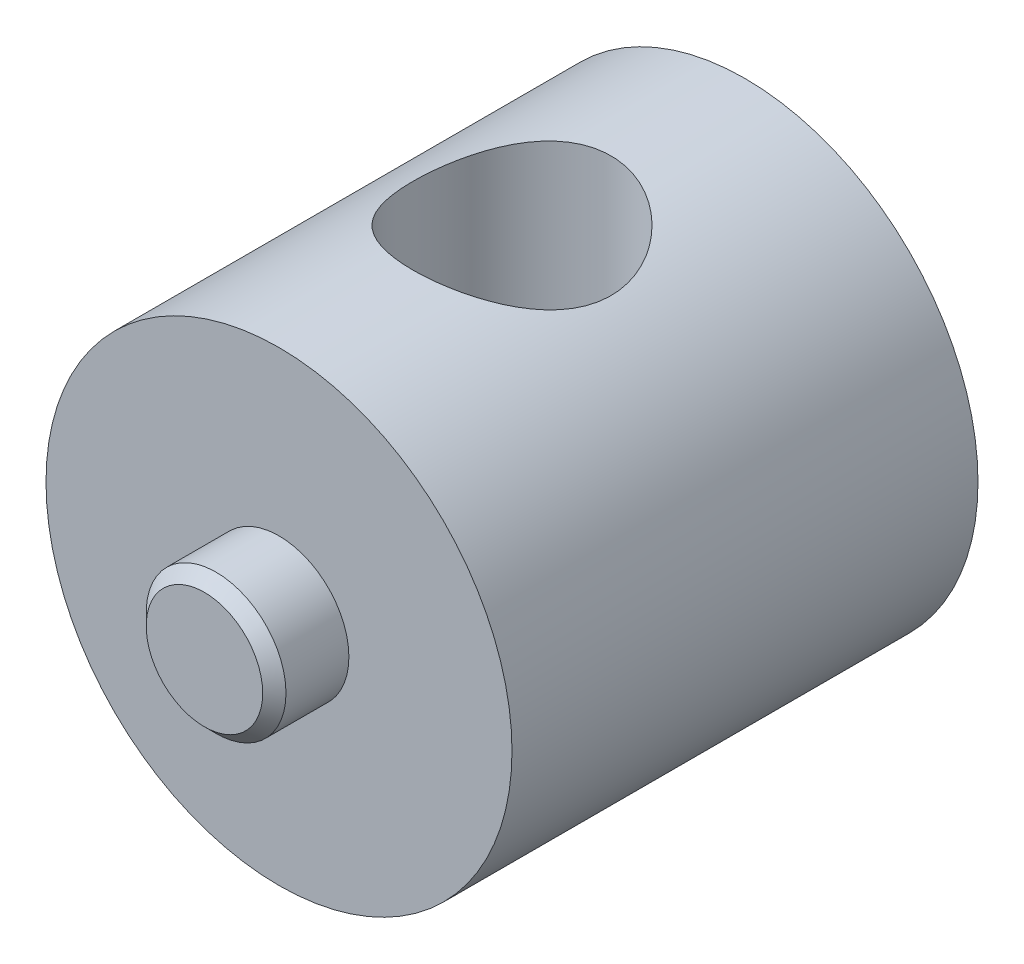
ISO-10303-21;
HEADER;
FILE_DESCRIPTION(('STEP AP214'),'2;1');
FILE_NAME('part.step','',(''),(''),'','','');
FILE_SCHEMA(('AUTOMOTIVE_DESIGN { 1 0 10303 214 1 1 1 1 }'));
ENDSEC;
DATA;
#1=APPLICATION_CONTEXT('core data for automotive mechanical design processes');
#2=APPLICATION_PROTOCOL_DEFINITION('international standard','automotive_design',2000,#1);
#3=PRODUCT_CONTEXT('',#1,'mechanical');
#4=PRODUCT('Part','Part','',(#3));
#5=PRODUCT_RELATED_PRODUCT_CATEGORY('part','',(#4));
#6=PRODUCT_DEFINITION_FORMATION('','',#4);
#7=PRODUCT_DEFINITION_CONTEXT('part definition',#1,'design');
#8=PRODUCT_DEFINITION('design','',#6,#7);
#9=PRODUCT_DEFINITION_SHAPE('','',#8);
#10=(LENGTH_UNIT() NAMED_UNIT(*) SI_UNIT(.MILLI.,.METRE.));
#11=(NAMED_UNIT(*) PLANE_ANGLE_UNIT() SI_UNIT($,.RADIAN.));
#12=(NAMED_UNIT(*) SI_UNIT($,.STERADIAN.) SOLID_ANGLE_UNIT());
#13=UNCERTAINTY_MEASURE_WITH_UNIT(LENGTH_MEASURE(1.E-05),#10,'distance_accuracy_value','');
#14=(GEOMETRIC_REPRESENTATION_CONTEXT(3) GLOBAL_UNCERTAINTY_ASSIGNED_CONTEXT((#13)) GLOBAL_UNIT_ASSIGNED_CONTEXT((#10,
#11,#12)) REPRESENTATION_CONTEXT('',''));
#15=CARTESIAN_POINT('',(0.,0.,0.));
#16=DIRECTION('',(0.,0.,1.));
#17=DIRECTION('',(1.,0.,0.));
#18=AXIS2_PLACEMENT_3D('',#15,#16,#17);
#19=CARTESIAN_POINT('',(0.,0.,20.));
#20=DIRECTION('',(0.,0.,-1.));
#21=DIRECTION('',(-1.,0.,0.));
#22=AXIS2_PLACEMENT_3D('',#19,#20,#21);
#23=CYLINDRICAL_SURFACE('',#22,10.);
#24=CARTESIAN_POINT('',(0.,-10.,14.25));
#25=CARTESIAN_POINT('',(0.113677010701556,-9.9999993202227,14.2499991489818));
#26=CARTESIAN_POINT('',(0.227390002840681,-9.99805623880879,14.245432746214));
#27=CARTESIAN_POINT('',(0.454001998651724,-9.99033301490753,14.227211761547));
#28=CARTESIAN_POINT('',(0.566900458780562,-9.98455051363963,14.2135515928012));
#29=CARTESIAN_POINT('',(0.79123203865508,-9.96928310683869,14.1772455171717));
#30=CARTESIAN_POINT('',(0.902661766499218,-9.95979080115523,14.1545816486137));
#31=CARTESIAN_POINT('',(1.12303885960079,-9.93735816549744,14.1005099312634));
#32=CARTESIAN_POINT('',(1.23198519049179,-9.92441642628079,14.0690985084824));
#33=CARTESIAN_POINT('',(1.55313632601812,-9.88099824492704,13.9624375156391));
#34=CARTESIAN_POINT('',(1.76068359514815,-9.84585421260864,13.8745916871478));
#35=CARTESIAN_POINT('',(2.15778395929118,-9.76652993480609,13.668326313854));
#36=CARTESIAN_POINT('',(2.34734208206891,-9.72235222508786,13.5499153462874));
#37=CARTESIAN_POINT('',(2.71333279483056,-9.62679879188588,13.279409694956));
#38=CARTESIAN_POINT('',(2.8887188806256,-9.575181288256,13.1259855552551));
#39=CARTESIAN_POINT('',(3.21223227660989,-9.47156108494723,12.7924935524296));
#40=CARTESIAN_POINT('',(3.36034469204757,-9.41955819082848,12.6124112269475));
#41=CARTESIAN_POINT('',(3.56273269354907,-9.34411580631012,12.3204473625352));
#42=CARTESIAN_POINT('',(3.62823008995036,-9.31881195375772,12.2166537667449));
#43=CARTESIAN_POINT('',(3.75018577037821,-9.27040479675505,12.0034148828343));
#44=CARTESIAN_POINT('',(3.80664774818123,-9.24730059463674,11.8939719285577));
#45=CARTESIAN_POINT('',(3.91004416781592,-9.20405886451464,11.6701080192539));
#46=CARTESIAN_POINT('',(3.95697833662412,-9.18392142152913,11.55568692169));
#47=CARTESIAN_POINT('',(4.04082235096461,-9.14734105992767,11.3227126632695));
#48=CARTESIAN_POINT('',(4.07773741915296,-9.13089621724511,11.2041616916992));
#49=CARTESIAN_POINT('',(4.13958476495511,-9.10301776019469,10.9696950739208));
#50=CARTESIAN_POINT('',(4.16501622792424,-9.09137781079844,10.8539356491891));
#51=CARTESIAN_POINT('',(4.20614460615987,-9.07242317616999,10.620400233497));
#52=CARTESIAN_POINT('',(4.22184607462374,-9.06510646793109,10.5026252123001));
#53=CARTESIAN_POINT('',(4.24332956160536,-9.05507017158341,10.2660108844064));
#54=CARTESIAN_POINT('',(4.24911439144241,-9.05234928058577,10.1471718889481));
#55=CARTESIAN_POINT('',(4.25069723023711,-9.05160615463458,9.90941782700017));
#56=CARTESIAN_POINT('',(4.24649579741935,-9.05358365704434,9.79050276513401));
#57=CARTESIAN_POINT('',(4.22890119912732,-9.06181439560418,9.56317066278652));
#58=CARTESIAN_POINT('',(4.21627687697756,-9.06770983718671,9.45468060861816));
#59=CARTESIAN_POINT('',(4.18277997451473,-9.08320870709349,9.2392397546982));
#60=CARTESIAN_POINT('',(4.16190470602441,-9.09281334385862,9.13228946838808));
#61=CARTESIAN_POINT('',(4.0871927408374,-9.12677022909441,8.81488586880751));
#62=CARTESIAN_POINT('',(4.02125514058213,-9.15627293981543,8.60769418116952));
#63=CARTESIAN_POINT('',(3.85774261830499,-9.22636545447978,8.20303938437112));
#64=CARTESIAN_POINT('',(3.75951307498225,-9.26718166298623,8.00588439109041));
#65=CARTESIAN_POINT('',(3.53465124820333,-9.35525552477842,7.63003874950811));
#66=CARTESIAN_POINT('',(3.40800751748348,-9.40251577116418,7.45135558547781));
#67=CARTESIAN_POINT('',(3.11680324432193,-9.50322425434588,7.10096466903154));
#68=CARTESIAN_POINT('',(2.94988263455246,-9.55685048537027,6.93126463182764));
#69=CARTESIAN_POINT('',(2.58944180731014,-9.66074261888042,6.62157438596439));
#70=CARTESIAN_POINT('',(2.39591487047007,-9.71100766772567,6.48159170514827));
#71=CARTESIAN_POINT('',(1.98144609781449,-9.80408225808898,6.23220596955852));
#72=CARTESIAN_POINT('',(1.75994172476466,-9.84667505152035,6.12365091612286));
#73=CARTESIAN_POINT('',(1.29954134540696,-9.91792875212495,5.94605505135394));
#74=CARTESIAN_POINT('',(1.06065543890027,-9.94659767680175,5.8769914963459));
#75=CARTESIAN_POINT('',(0.589018027188858,-9.98525693893447,5.78461308481628));
#76=CARTESIAN_POINT('',(0.356883589560014,-9.99634415287782,5.75860677853622));
#77=CARTESIAN_POINT('',(-0.108679830348578,-10.0021156610579,5.74501782259278));
#78=CARTESIAN_POINT('',(-0.342108400378225,-9.99680490940531,5.75742356798338));
#79=CARTESIAN_POINT('',(-0.790820295706893,-9.97108450072209,5.8184079919149));
#80=CARTESIAN_POINT('',(-1.00641547026157,-9.95147565148115,5.86506901046661));
#81=CARTESIAN_POINT('',(-1.42646420236818,-9.90000027628472,5.99054049646478));
#82=CARTESIAN_POINT('',(-1.63091636321827,-9.86813221773541,6.06935498367474));
#83=CARTESIAN_POINT('',(-2.03008552099075,-9.79394056474646,6.25945784553217));
#84=CARTESIAN_POINT('',(-2.22429988301423,-9.75132182595808,6.37168253221669));
#85=CARTESIAN_POINT('',(-2.59184226357495,-9.66013805917468,6.62440607124365));
#86=CARTESIAN_POINT('',(-2.76516136974161,-9.61157051153782,6.76491692063183));
#87=CARTESIAN_POINT('',(-3.09950633765641,-9.50925140592673,7.08236428596626));
#88=CARTESIAN_POINT('',(-3.25866563312504,-9.45538259913105,7.26123005588488));
#89=CARTESIAN_POINT('',(-3.54531249912717,-9.35168739183024,7.64407843896596));
#90=CARTESIAN_POINT('',(-3.67279176527431,-9.30186205355252,7.84806761689292));
#91=CARTESIAN_POINT('',(-3.83822490191956,-9.23426540442613,8.17091718539808));
#92=CARTESIAN_POINT('',(-3.88940372033199,-9.2127671263081,8.28240050446519));
#93=CARTESIAN_POINT('',(-3.98209310208837,-9.17308443883657,8.50986855375646));
#94=CARTESIAN_POINT('',(-4.02360794786299,-9.1548985624269,8.62585126346534));
#95=CARTESIAN_POINT('',(-4.09650697370751,-9.12251191219804,8.8614343359345));
#96=CARTESIAN_POINT('',(-4.12789616880964,-9.10830916607081,8.98103287564421));
#97=CARTESIAN_POINT('',(-4.18019034551947,-9.08442835397214,9.22294416468686));
#98=CARTESIAN_POINT('',(-4.20109637044893,-9.07474983774001,9.34525664265345));
#99=CARTESIAN_POINT('',(-4.23090857482752,-9.06088620883668,9.58171501778108));
#100=CARTESIAN_POINT('',(-4.24063765754596,-9.05632506405752,9.69573574927314));
#101=CARTESIAN_POINT('',(-4.25086655818531,-9.05152837470597,9.92432194480718));
#102=CARTESIAN_POINT('',(-4.25136329161358,-9.05129427578321,10.0388875781124));
#103=CARTESIAN_POINT('',(-4.24311097533725,-9.05516608854555,10.2675548115736));
#104=CARTESIAN_POINT('',(-4.23436691354737,-9.05926965888216,10.3816566287285));
#105=CARTESIAN_POINT('',(-4.20775610530268,-9.07165858349788,10.6085751379209));
#106=CARTESIAN_POINT('',(-4.18988592085188,-9.07994551372018,10.721391329251));
#107=CARTESIAN_POINT('',(-4.12512147022873,-9.10964571470631,11.0452481672725));
#108=CARTESIAN_POINT('',(-4.06657122964406,-9.1361655079803,11.2536192588993));
#109=CARTESIAN_POINT('',(-3.91938458598324,-9.2002602527255,11.6574818696945));
#110=CARTESIAN_POINT('',(-3.83073965904677,-9.23783833588634,11.8529697211292));
#111=CARTESIAN_POINT('',(-3.61959902632086,-9.32267067208766,12.2388049936898));
#112=CARTESIAN_POINT('',(-3.49535824540964,-9.37037755592548,12.4280987634013));
#113=CARTESIAN_POINT('',(-3.21898596659377,-9.46887884692678,12.7841542875505));
#114=CARTESIAN_POINT('',(-3.06684418255117,-9.5196743881401,12.950907692619));
#115=CARTESIAN_POINT('',(-2.72492668123888,-9.62335420844412,13.2704806952933));
#116=CARTESIAN_POINT('',(-2.53315443575608,-9.67609784486143,13.4212365763749));
#117=CARTESIAN_POINT('',(-2.2274115639947,-9.7493443543597,13.6216108468576));
#118=CARTESIAN_POINT('',(-2.1223895721507,-9.77279852905516,13.6841497236724));
#119=CARTESIAN_POINT('',(-1.90693593814686,-9.81711050493701,13.8001362112189));
#120=CARTESIAN_POINT('',(-1.79650682648898,-9.83796950476888,13.8535880232472));
#121=CARTESIAN_POINT('',(-1.57262713778778,-9.87621165882794,13.9501892279014));
#122=CARTESIAN_POINT('',(-1.4592447557043,-9.89364136255111,13.9934783997518));
#123=CARTESIAN_POINT('',(-1.22878834218432,-9.92489738464772,14.0702972712934));
#124=CARTESIAN_POINT('',(-1.11171609947767,-9.9387254197725,14.1038316215575));
#125=CARTESIAN_POINT('',(-0.875036387460939,-9.96235029553389,14.1607200680094));
#126=CARTESIAN_POINT('',(-0.755435885359912,-9.97215699734158,14.1840990757333));
#127=CARTESIAN_POINT('',(-0.514458537598619,-9.98748649093899,14.2205049110775));
#128=CARTESIAN_POINT('',(-0.393083039839861,-9.99301237724913,14.2335392168541));
#129=CARTESIAN_POINT('',(-0.226199863278975,-9.99754373765534,14.244217783778));
#130=CARTESIAN_POINT('',(-0.180994045079613,-9.99846427489234,14.2463854563052));
#131=CARTESIAN_POINT('',(-0.0905273865819376,-9.99969254297848,14.2492767375527));
#132=CARTESIAN_POINT('',(-0.0452665460030467,-10.0000002706895,14.2500003388781));
#133=CARTESIAN_POINT('',(0.,-10.,14.25));
#134=B_SPLINE_CURVE_WITH_KNOTS('',3,(#24,#25,#26,#27,#28,#29,#30,#31,#32,#33,#34,#35,#36,#37,
#38,#39,#40,#41,#42,#43,#44,#45,#46,#47,#48,#49,#50,#51,#52,#53,#54,#55,#56,#57,#58,#59,#60,#61,
#62,#63,#64,#65,#66,#67,#68,#69,#70,#71,#72,#73,#74,#75,#76,#77,#78,#79,#80,#81,#82,#83,#84,#85,
#86,#87,#88,#89,#90,#91,#92,#93,#94,#95,#96,#97,#98,#99,#100,#101,#102,#103,#104,#105,#106,#107,
#108,#109,#110,#111,#112,#113,#114,#115,#116,#117,#118,#119,#120,#121,#122,#123,#124,#125,#126,
#127,#128,#129,#130,#131,#132,#133),.UNSPECIFIED.,.T.,.F.,(4,2,2,2,2,2,2,2,2,2,2,2,2,2,2,2,2,2,
2,2,2,2,2,2,2,2,2,2,2,2,2,2,2,2,2,2,2,2,2,2,2,2,2,2,2,2,2,2,2,2,2,2,2,2,4),(0.,
0.340984938318925,0.682179557735861,1.02405827938089,1.36607688788231,2.04701335614069,
2.72775894631527,3.4407382045737,4.15410568912276,4.52965078311537,4.90504195584266,
5.28044388404752,5.65564974902582,6.01244083677808,6.36906483610646,6.72558771751804,
7.08209067003653,7.40983435594,7.73768490962246,8.39283383458289,9.06217993015749,
9.73179617189363,10.4605154263028,11.1894190563265,11.9364680771258,12.6830864280958,
13.3809800136215,14.0786627739841,14.7400078846904,15.4014357008125,16.0834964145367,
16.7658470233297,17.4988311874153,18.2320072887681,18.605210530717,18.9782480776172,
19.3511005817984,19.7239159710254,20.0670475382192,20.4102937422991,20.7533547665625,
21.0965451243304,21.7475903075051,22.3988200433388,23.0900586865992,23.7815526798929,
24.5263289253326,24.8993296673328,25.2721574850899,25.6395096843311,26.0066864617427,
26.3729573794923,26.7389632792288,26.8747438672279,27.0105251505455),.UNSPECIFIED.);
#135=CARTESIAN_POINT('',(0.,-10.,14.25));
#136=VERTEX_POINT('',#135);
#137=EDGE_CURVE('E10',#136,#136,#134,.T.);
#138=ORIENTED_EDGE('',*,*,#137,.T.);
#139=EDGE_LOOP('',(#138));
#140=FACE_BOUND('',#139,.T.);
#141=CARTESIAN_POINT('',(0.,10.,14.25));
#142=CARTESIAN_POINT('',(-0.113677010701556,9.9999993202227,14.2499991489818));
#143=CARTESIAN_POINT('',(-0.227390002840681,9.99805623880879,14.245432746214));
#144=CARTESIAN_POINT('',(-0.454001998651724,9.99033301490753,14.227211761547));
#145=CARTESIAN_POINT('',(-0.566900458780562,9.98455051363963,14.2135515928012));
#146=CARTESIAN_POINT('',(-0.79123203865508,9.96928310683869,14.1772455171717));
#147=CARTESIAN_POINT('',(-0.902661766499218,9.95979080115523,14.1545816486137));
#148=CARTESIAN_POINT('',(-1.12303885960079,9.93735816549744,14.1005099312634));
#149=CARTESIAN_POINT('',(-1.23198519049179,9.92441642628079,14.0690985084824));
#150=CARTESIAN_POINT('',(-1.55313632601812,9.88099824492704,13.9624375156391));
#151=CARTESIAN_POINT('',(-1.76068359514815,9.84585421260864,13.8745916871478));
#152=CARTESIAN_POINT('',(-2.15778395929118,9.76652993480609,13.668326313854));
#153=CARTESIAN_POINT('',(-2.34734208206891,9.72235222508786,13.5499153462874));
#154=CARTESIAN_POINT('',(-2.71333279483056,9.62679879188588,13.279409694956));
#155=CARTESIAN_POINT('',(-2.8887188806256,9.575181288256,13.1259855552551));
#156=CARTESIAN_POINT('',(-3.21223227660989,9.47156108494723,12.7924935524296));
#157=CARTESIAN_POINT('',(-3.36034469204757,9.41955819082848,12.6124112269475));
#158=CARTESIAN_POINT('',(-3.56273269354907,9.34411580631012,12.3204473625352));
#159=CARTESIAN_POINT('',(-3.62823008995036,9.31881195375772,12.2166537667449));
#160=CARTESIAN_POINT('',(-3.75018577037821,9.27040479675505,12.0034148828343));
#161=CARTESIAN_POINT('',(-3.80664774818123,9.24730059463674,11.8939719285577));
#162=CARTESIAN_POINT('',(-3.91004416781592,9.20405886451464,11.6701080192539));
#163=CARTESIAN_POINT('',(-3.95697833662412,9.18392142152913,11.55568692169));
#164=CARTESIAN_POINT('',(-4.04082235096461,9.14734105992767,11.3227126632695));
#165=CARTESIAN_POINT('',(-4.07773741915296,9.13089621724511,11.2041616916992));
#166=CARTESIAN_POINT('',(-4.13958476495511,9.10301776019469,10.9696950739208));
#167=CARTESIAN_POINT('',(-4.16501622792424,9.09137781079844,10.8539356491891));
#168=CARTESIAN_POINT('',(-4.20614460615987,9.07242317616999,10.620400233497));
#169=CARTESIAN_POINT('',(-4.22184607462374,9.06510646793109,10.5026252123001));
#170=CARTESIAN_POINT('',(-4.24332956160536,9.05507017158341,10.2660108844064));
#171=CARTESIAN_POINT('',(-4.24911439144241,9.05234928058577,10.1471718889481));
#172=CARTESIAN_POINT('',(-4.25069723023711,9.05160615463458,9.90941782700017));
#173=CARTESIAN_POINT('',(-4.24649579741935,9.05358365704434,9.79050276513401));
#174=CARTESIAN_POINT('',(-4.22890119912732,9.06181439560418,9.56317066278652));
#175=CARTESIAN_POINT('',(-4.21627687697756,9.06770983718671,9.45468060861816));
#176=CARTESIAN_POINT('',(-4.18277997451473,9.08320870709349,9.2392397546982));
#177=CARTESIAN_POINT('',(-4.16190470602441,9.09281334385862,9.13228946838808));
#178=CARTESIAN_POINT('',(-4.0871927408374,9.12677022909441,8.81488586880751));
#179=CARTESIAN_POINT('',(-4.02125514058213,9.15627293981543,8.60769418116952));
#180=CARTESIAN_POINT('',(-3.85774261830499,9.22636545447978,8.20303938437112));
#181=CARTESIAN_POINT('',(-3.75951307498225,9.26718166298623,8.00588439109041));
#182=CARTESIAN_POINT('',(-3.53465124820333,9.35525552477842,7.63003874950811));
#183=CARTESIAN_POINT('',(-3.40800751748348,9.40251577116418,7.45135558547781));
#184=CARTESIAN_POINT('',(-3.11680324432193,9.50322425434588,7.10096466903154));
#185=CARTESIAN_POINT('',(-2.94988263455246,9.55685048537027,6.93126463182764));
#186=CARTESIAN_POINT('',(-2.58944180731014,9.66074261888042,6.62157438596439));
#187=CARTESIAN_POINT('',(-2.39591487047007,9.71100766772567,6.48159170514827));
#188=CARTESIAN_POINT('',(-1.98144609781449,9.80408225808898,6.23220596955852));
#189=CARTESIAN_POINT('',(-1.75994172476466,9.84667505152035,6.12365091612286));
#190=CARTESIAN_POINT('',(-1.29954134540696,9.91792875212495,5.94605505135394));
#191=CARTESIAN_POINT('',(-1.06065543890027,9.94659767680175,5.8769914963459));
#192=CARTESIAN_POINT('',(-0.589018027188858,9.98525693893447,5.78461308481628));
#193=CARTESIAN_POINT('',(-0.356883589560014,9.99634415287782,5.75860677853622));
#194=CARTESIAN_POINT('',(0.108679830348578,10.0021156610579,5.74501782259278));
#195=CARTESIAN_POINT('',(0.342108400378225,9.99680490940531,5.75742356798338));
#196=CARTESIAN_POINT('',(0.790820295706893,9.97108450072209,5.8184079919149));
#197=CARTESIAN_POINT('',(1.00641547026157,9.95147565148115,5.86506901046661));
#198=CARTESIAN_POINT('',(1.42646420236818,9.90000027628472,5.99054049646478));
#199=CARTESIAN_POINT('',(1.63091636321827,9.86813221773541,6.06935498367474));
#200=CARTESIAN_POINT('',(2.03008552099075,9.79394056474646,6.25945784553217));
#201=CARTESIAN_POINT('',(2.22429988301423,9.75132182595808,6.37168253221669));
#202=CARTESIAN_POINT('',(2.59184226357495,9.66013805917468,6.62440607124365));
#203=CARTESIAN_POINT('',(2.76516136974161,9.61157051153782,6.76491692063183));
#204=CARTESIAN_POINT('',(3.09950633765641,9.50925140592673,7.08236428596626));
#205=CARTESIAN_POINT('',(3.25866563312504,9.45538259913105,7.26123005588488));
#206=CARTESIAN_POINT('',(3.54531249912717,9.35168739183024,7.64407843896596));
#207=CARTESIAN_POINT('',(3.67279176527431,9.30186205355252,7.84806761689292));
#208=CARTESIAN_POINT('',(3.83822490191956,9.23426540442613,8.17091718539808));
#209=CARTESIAN_POINT('',(3.88940372033199,9.2127671263081,8.28240050446519));
#210=CARTESIAN_POINT('',(3.98209310208837,9.17308443883657,8.50986855375646));
#211=CARTESIAN_POINT('',(4.02360794786299,9.1548985624269,8.62585126346534));
#212=CARTESIAN_POINT('',(4.09650697370751,9.12251191219804,8.8614343359345));
#213=CARTESIAN_POINT('',(4.12789616880964,9.10830916607081,8.98103287564421));
#214=CARTESIAN_POINT('',(4.18019034551947,9.08442835397214,9.22294416468686));
#215=CARTESIAN_POINT('',(4.20109637044893,9.07474983774001,9.34525664265345));
#216=CARTESIAN_POINT('',(4.23090857482752,9.06088620883668,9.58171501778108));
#217=CARTESIAN_POINT('',(4.24063765754596,9.05632506405752,9.69573574927314));
#218=CARTESIAN_POINT('',(4.25086655818531,9.05152837470597,9.92432194480718));
#219=CARTESIAN_POINT('',(4.25136329161358,9.05129427578321,10.0388875781124));
#220=CARTESIAN_POINT('',(4.24311097533725,9.05516608854555,10.2675548115736));
#221=CARTESIAN_POINT('',(4.23436691354737,9.05926965888216,10.3816566287285));
#222=CARTESIAN_POINT('',(4.20775610530268,9.07165858349788,10.6085751379209));
#223=CARTESIAN_POINT('',(4.18988592085188,9.07994551372018,10.721391329251));
#224=CARTESIAN_POINT('',(4.12512147022873,9.10964571470631,11.0452481672725));
#225=CARTESIAN_POINT('',(4.06657122964406,9.1361655079803,11.2536192588993));
#226=CARTESIAN_POINT('',(3.91938458598324,9.2002602527255,11.6574818696945));
#227=CARTESIAN_POINT('',(3.83073965904677,9.23783833588634,11.8529697211292));
#228=CARTESIAN_POINT('',(3.61959902632086,9.32267067208766,12.2388049936898));
#229=CARTESIAN_POINT('',(3.49535824540964,9.37037755592548,12.4280987634013));
#230=CARTESIAN_POINT('',(3.21898596659377,9.46887884692678,12.7841542875505));
#231=CARTESIAN_POINT('',(3.06684418255117,9.5196743881401,12.950907692619));
#232=CARTESIAN_POINT('',(2.72492668123888,9.62335420844412,13.2704806952933));
#233=CARTESIAN_POINT('',(2.53315443575608,9.67609784486143,13.4212365763749));
#234=CARTESIAN_POINT('',(2.2274115639947,9.7493443543597,13.6216108468576));
#235=CARTESIAN_POINT('',(2.1223895721507,9.77279852905516,13.6841497236724));
#236=CARTESIAN_POINT('',(1.90693593814686,9.81711050493701,13.8001362112189));
#237=CARTESIAN_POINT('',(1.79650682648898,9.83796950476888,13.8535880232472));
#238=CARTESIAN_POINT('',(1.57262713778778,9.87621165882794,13.9501892279014));
#239=CARTESIAN_POINT('',(1.4592447557043,9.89364136255111,13.9934783997518));
#240=CARTESIAN_POINT('',(1.22878834218432,9.92489738464772,14.0702972712934));
#241=CARTESIAN_POINT('',(1.11171609947767,9.9387254197725,14.1038316215575));
#242=CARTESIAN_POINT('',(0.87503638746094,9.96235029553389,14.1607200680094));
#243=CARTESIAN_POINT('',(0.755435885359914,9.97215699734158,14.1840990757333));
#244=CARTESIAN_POINT('',(0.514458537598621,9.98748649093899,14.2205049110775));
#245=CARTESIAN_POINT('',(0.393083039839862,9.99301237724913,14.2335392168541));
#246=CARTESIAN_POINT('',(0.226199863278975,9.99754373765534,14.244217783778));
#247=CARTESIAN_POINT('',(0.180994045079613,9.99846427489234,14.2463854563052));
#248=CARTESIAN_POINT('',(0.0905273865819376,9.99969254297848,14.2492767375527));
#249=CARTESIAN_POINT('',(0.0452665460030467,10.0000002706895,14.2500003388781));
#250=CARTESIAN_POINT('',(0.,10.,14.25));
#251=B_SPLINE_CURVE_WITH_KNOTS('',3,(#141,#142,#143,#144,#145,#146,#147,#148,#149,#150,#151,
#152,#153,#154,#155,#156,#157,#158,#159,#160,#161,#162,#163,#164,#165,#166,#167,#168,#169,#170,
#171,#172,#173,#174,#175,#176,#177,#178,#179,#180,#181,#182,#183,#184,#185,#186,#187,#188,#189,
#190,#191,#192,#193,#194,#195,#196,#197,#198,#199,#200,#201,#202,#203,#204,#205,#206,#207,#208,
#209,#210,#211,#212,#213,#214,#215,#216,#217,#218,#219,#220,#221,#222,#223,#224,#225,#226,#227,
#228,#229,#230,#231,#232,#233,#234,#235,#236,#237,#238,#239,#240,#241,#242,#243,#244,#245,#246,
#247,#248,#249,#250),.UNSPECIFIED.,.T.,.F.,(4,2,2,2,2,2,2,2,2,2,2,2,2,2,2,2,2,2,2,2,2,2,2,2,2,2,
2,2,2,2,2,2,2,2,2,2,2,2,2,2,2,2,2,2,2,2,2,2,2,2,2,2,2,2,4),(0.,0.340984938318925,
0.682179557735861,1.02405827938089,1.36607688788231,2.04701335614069,2.72775894631527,
3.4407382045737,4.15410568912276,4.52965078311537,4.90504195584266,5.28044388404752,
5.65564974902582,6.01244083677808,6.36906483610646,6.72558771751804,7.08209067003653,
7.40983435594,7.73768490962246,8.39283383458289,9.06217993015749,9.73179617189363,
10.4605154263028,11.1894190563265,11.9364680771258,12.6830864280958,13.3809800136215,
14.0786627739841,14.7400078846904,15.4014357008125,16.0834964145367,16.7658470233297,
17.4988311874153,18.2320072887681,18.605210530717,18.9782480776172,19.3511005817984,
19.7239159710254,20.0670475382192,20.4102937422991,20.7533547665625,21.0965451243304,
21.7475903075051,22.3988200433388,23.0900586865992,23.7815526798929,24.5263289253326,
24.8993296673328,25.2721574850899,25.6395096843311,26.0066864617427,26.3729573794923,
26.7389632792288,26.8747438672279,27.0105251505455),.UNSPECIFIED.);
#252=CARTESIAN_POINT('',(0.,10.,14.25));
#253=VERTEX_POINT('',#252);
#254=EDGE_CURVE('E55',#253,#253,#251,.T.);
#255=ORIENTED_EDGE('',*,*,#254,.T.);
#256=EDGE_LOOP('',(#255));
#257=FACE_BOUND('',#256,.T.);
#258=CARTESIAN_POINT('',(0.,0.,20.));
#259=DIRECTION('',(0.,0.,1.));
#260=DIRECTION('',(1.,0.,0.));
#261=AXIS2_PLACEMENT_3D('',#258,#259,#260);
#262=CIRCLE('',#261,10.);
#263=CARTESIAN_POINT('',(10.,0.,20.));
#264=VERTEX_POINT('',#263);
#265=EDGE_CURVE('E108',#264,#264,#262,.T.);
#266=ORIENTED_EDGE('',*,*,#265,.F.);
#267=EDGE_LOOP('',(#266));
#268=FACE_BOUND('',#267,.T.);
#269=CARTESIAN_POINT('',(0.,0.,0.));
#270=DIRECTION('',(0.,0.,1.));
#271=DIRECTION('',(1.,0.,0.));
#272=AXIS2_PLACEMENT_3D('',#269,#270,#271);
#273=CIRCLE('',#272,10.);
#274=CARTESIAN_POINT('',(10.,0.,0.));
#275=VERTEX_POINT('',#274);
#276=EDGE_CURVE('E111',#275,#275,#273,.T.);
#277=ORIENTED_EDGE('',*,*,#276,.T.);
#278=EDGE_LOOP('',(#277));
#279=FACE_BOUND('',#278,.T.);
#280=ADVANCED_FACE('F42',(#140,#257,#268,#279),#23,.T.);
#281=CARTESIAN_POINT('',(0.,0.,20.));
#282=DIRECTION('',(0.,0.,1.));
#283=DIRECTION('',(1.,0.,0.));
#284=AXIS2_PLACEMENT_3D('',#281,#282,#283);
#285=PLANE('',#284);
#286=CARTESIAN_POINT('',(0.,0.,20.));
#287=DIRECTION('',(0.,0.,1.));
#288=DIRECTION('',(1.,0.,0.));
#289=AXIS2_PLACEMENT_3D('',#286,#287,#288);
#290=CIRCLE('',#289,3.);
#291=CARTESIAN_POINT('',(3.,0.,20.));
#292=VERTEX_POINT('',#291);
#293=EDGE_CURVE('E112',#292,#292,#290,.F.);
#294=ORIENTED_EDGE('',*,*,#293,.T.);
#295=EDGE_LOOP('',(#294));
#296=FACE_BOUND('',#295,.T.);
#297=ORIENTED_EDGE('',*,*,#265,.T.);
#298=EDGE_LOOP('',(#297));
#299=FACE_BOUND('',#298,.T.);
#300=ADVANCED_FACE('F92',(#296,#299),#285,.T.);
#301=CARTESIAN_POINT('',(0.,0.,0.));
#302=DIRECTION('',(0.,0.,1.));
#303=DIRECTION('',(1.,0.,0.));
#304=AXIS2_PLACEMENT_3D('',#301,#302,#303);
#305=PLANE('',#304);
#306=CARTESIAN_POINT('',(0.,0.,0.));
#307=DIRECTION('',(0.,0.,1.));
#308=DIRECTION('',(1.,0.,0.));
#309=AXIS2_PLACEMENT_3D('',#306,#307,#308);
#310=CIRCLE('',#309,3.);
#311=CARTESIAN_POINT('',(3.,0.,0.));
#312=VERTEX_POINT('',#311);
#313=EDGE_CURVE('E114',#312,#312,#310,.F.);
#314=ORIENTED_EDGE('',*,*,#313,.F.);
#315=EDGE_LOOP('',(#314));
#316=FACE_BOUND('',#315,.T.);
#317=ORIENTED_EDGE('',*,*,#276,.F.);
#318=EDGE_LOOP('',(#317));
#319=FACE_BOUND('',#318,.T.);
#320=ADVANCED_FACE('F87',(#316,#319),#305,.F.);
#321=CARTESIAN_POINT('',(0.,0.,-3.2));
#322=DIRECTION('',(0.,0.,1.));
#323=DIRECTION('',(1.,0.,0.));
#324=AXIS2_PLACEMENT_3D('',#321,#322,#323);
#325=PLANE('',#324);
#326=CARTESIAN_POINT('',(0.,0.,-3.2));
#327=DIRECTION('',(0.,0.,1.));
#328=DIRECTION('',(1.,0.,0.));
#329=AXIS2_PLACEMENT_3D('',#326,#327,#328);
#330=CIRCLE('',#329,2.5);
#331=CARTESIAN_POINT('',(2.5,0.,-3.2));
#332=VERTEX_POINT('',#331);
#333=EDGE_CURVE('E59',#332,#332,#330,.F.);
#334=ORIENTED_EDGE('',*,*,#333,.T.);
#335=EDGE_LOOP('',(#334));
#336=FACE_BOUND('',#335,.T.);
#337=ADVANCED_FACE('F83',(#336),#325,.F.);
#338=CARTESIAN_POINT('',(0.,0.,23.2));
#339=DIRECTION('',(0.,0.,-1.));
#340=DIRECTION('',(-1.,0.,0.));
#341=AXIS2_PLACEMENT_3D('',#338,#339,#340);
#342=CYLINDRICAL_SURFACE('',#341,3.);
#343=CARTESIAN_POINT('',(0.,0.,-2.7));
#344=DIRECTION('',(0.,0.,1.));
#345=DIRECTION('',(1.,0.,0.));
#346=AXIS2_PLACEMENT_3D('',#343,#344,#345);
#347=CIRCLE('',#346,3.);
#348=CARTESIAN_POINT('',(3.,0.,-2.7));
#349=VERTEX_POINT('',#348);
#350=EDGE_CURVE('E63',#349,#349,#347,.T.);
#351=ORIENTED_EDGE('',*,*,#350,.T.);
#352=EDGE_LOOP('',(#351));
#353=FACE_BOUND('',#352,.T.);
#354=ORIENTED_EDGE('',*,*,#313,.T.);
#355=EDGE_LOOP('',(#354));
#356=FACE_BOUND('',#355,.T.);
#357=ADVANCED_FACE('F86',(#353,#356),#342,.T.);
#358=CARTESIAN_POINT('',(0.,0.,22.7));
#359=DIRECTION('',(0.,0.,1.));
#360=DIRECTION('',(1.,0.,0.));
#361=AXIS2_PLACEMENT_3D('',#358,#359,#360);
#362=CIRCLE('',#361,3.);
#363=CARTESIAN_POINT('',(3.,0.,22.7));
#364=VERTEX_POINT('',#363);
#365=EDGE_CURVE('E124',#364,#364,#362,.F.);
#366=ORIENTED_EDGE('',*,*,#365,.T.);
#367=EDGE_LOOP('',(#366));
#368=FACE_BOUND('',#367,.T.);
#369=ORIENTED_EDGE('',*,*,#293,.F.);
#370=EDGE_LOOP('',(#369));
#371=FACE_BOUND('',#370,.T.);
#372=ADVANCED_FACE('F81',(#368,#371),#342,.T.);
#373=CARTESIAN_POINT('',(0.,0.,23.2));
#374=DIRECTION('',(0.,0.,1.));
#375=DIRECTION('',(1.,0.,0.));
#376=AXIS2_PLACEMENT_3D('',#373,#374,#375);
#377=PLANE('',#376);
#378=CARTESIAN_POINT('',(0.,0.,23.2));
#379=DIRECTION('',(0.,0.,1.));
#380=DIRECTION('',(1.,0.,0.));
#381=AXIS2_PLACEMENT_3D('',#378,#379,#380);
#382=CIRCLE('',#381,2.50000000000001);
#383=CARTESIAN_POINT('',(2.50000000000001,0.,23.2));
#384=VERTEX_POINT('',#383);
#385=EDGE_CURVE('E121',#384,#384,#382,.T.);
#386=ORIENTED_EDGE('',*,*,#385,.T.);
#387=EDGE_LOOP('',(#386));
#388=FACE_BOUND('',#387,.T.);
#389=ADVANCED_FACE('F76',(#388),#377,.T.);
#390=CARTESIAN_POINT('',(0.,0.,23.2));
#391=DIRECTION('',(0.,0.,-1.));
#392=DIRECTION('',(-1.,0.,0.));
#393=AXIS2_PLACEMENT_3D('',#390,#391,#392);
#394=CONICAL_SURFACE('',#393,2.50000000000001,0.785398163397443);
#395=ORIENTED_EDGE('',*,*,#365,.F.);
#396=EDGE_LOOP('',(#395));
#397=FACE_BOUND('',#396,.T.);
#398=ORIENTED_EDGE('',*,*,#385,.F.);
#399=EDGE_LOOP('',(#398));
#400=FACE_BOUND('',#399,.T.);
#401=ADVANCED_FACE('F80',(#397,#400),#394,.T.);
#402=CARTESIAN_POINT('',(0.,0.,-2.7));
#403=DIRECTION('',(0.,0.,1.));
#404=DIRECTION('',(1.,0.,0.));
#405=AXIS2_PLACEMENT_3D('',#402,#403,#404);
#406=CONICAL_SURFACE('',#405,3.,0.785398163397442);
#407=ORIENTED_EDGE('',*,*,#333,.F.);
#408=EDGE_LOOP('',(#407));
#409=FACE_BOUND('',#408,.T.);
#410=ORIENTED_EDGE('',*,*,#350,.F.);
#411=EDGE_LOOP('',(#410));
#412=FACE_BOUND('',#411,.T.);
#413=ADVANCED_FACE('F45',(#409,#412),#406,.T.);
#414=CARTESIAN_POINT('',(0.,10.,10.));
#415=DIRECTION('',(0.,1.,0.));
#416=DIRECTION('',(0.,0.,1.));
#417=AXIS2_PLACEMENT_3D('',#414,#415,#416);
#418=CYLINDRICAL_SURFACE('',#417,4.24999999999999);
#419=ORIENTED_EDGE('',*,*,#254,.F.);
#420=EDGE_LOOP('',(#419));
#421=FACE_BOUND('',#420,.T.);
#422=ORIENTED_EDGE('',*,*,#137,.F.);
#423=EDGE_LOOP('',(#422));
#424=FACE_BOUND('',#423,.T.);
#425=ADVANCED_FACE('F71',(#421,#424),#418,.F.);
#426=CLOSED_SHELL('',(#280,#300,#320,#337,#357,#372,#389,#401,#413,#425));
#427=MANIFOLD_SOLID_BREP('B2',#426);
#428=ADVANCED_BREP_SHAPE_REPRESENTATION('',(#18,#427),#14);
#429=SHAPE_DEFINITION_REPRESENTATION(#9,#428);
ENDSEC;
END-ISO-10303-21;
